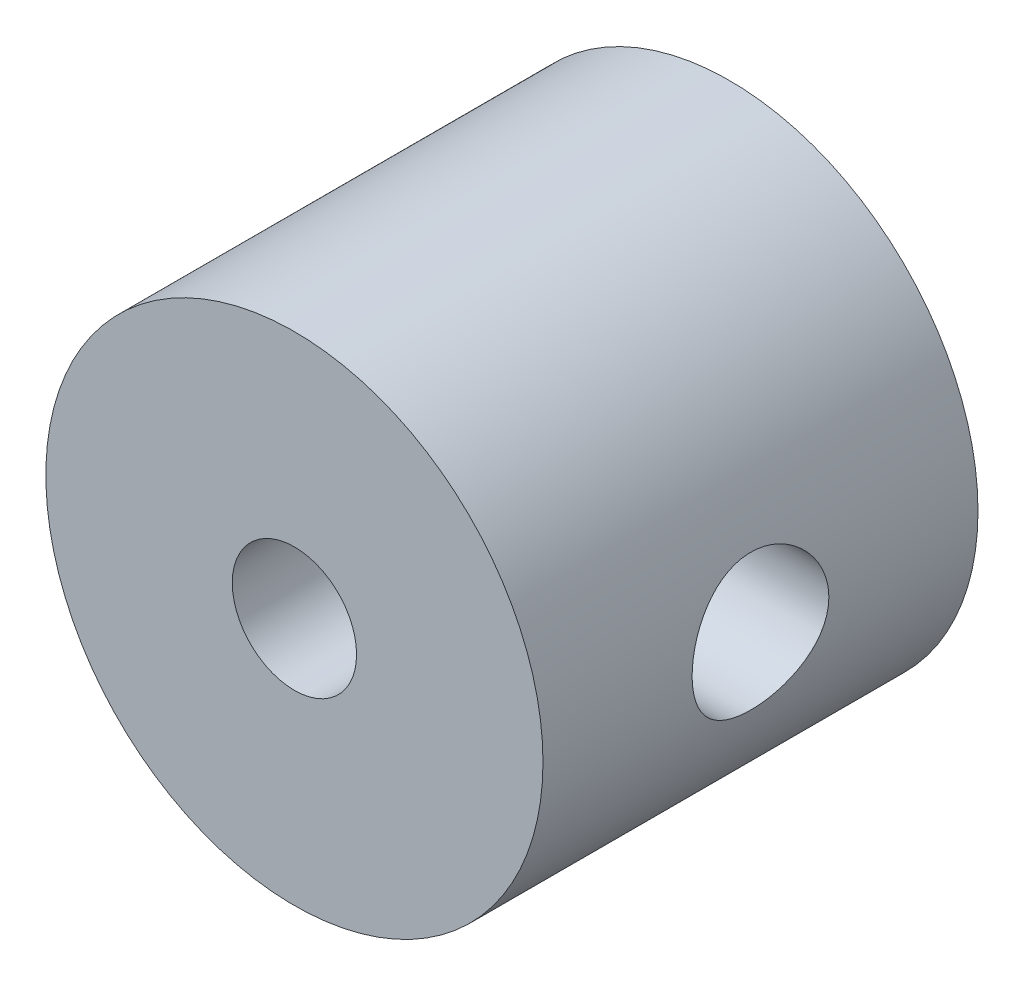
ISO-10303-21;
HEADER;
FILE_DESCRIPTION(('STEP AP214'),'2;1');
FILE_NAME('part.step','',(''),(''),'','','');
FILE_SCHEMA(('AUTOMOTIVE_DESIGN { 1 0 10303 214 1 1 1 1 }'));
ENDSEC;
DATA;
#1=APPLICATION_CONTEXT('core data for automotive mechanical design processes');
#2=APPLICATION_PROTOCOL_DEFINITION('international standard','automotive_design',2000,#1);
#3=PRODUCT_CONTEXT('',#1,'mechanical');
#4=PRODUCT('Part','Part','',(#3));
#5=PRODUCT_RELATED_PRODUCT_CATEGORY('part','',(#4));
#6=PRODUCT_DEFINITION_FORMATION('','',#4);
#7=PRODUCT_DEFINITION_CONTEXT('part definition',#1,'design');
#8=PRODUCT_DEFINITION('design','',#6,#7);
#9=PRODUCT_DEFINITION_SHAPE('','',#8);
#10=(LENGTH_UNIT() NAMED_UNIT(*) SI_UNIT(.MILLI.,.METRE.));
#11=(NAMED_UNIT(*) PLANE_ANGLE_UNIT() SI_UNIT($,.RADIAN.));
#12=(NAMED_UNIT(*) SI_UNIT($,.STERADIAN.) SOLID_ANGLE_UNIT());
#13=UNCERTAINTY_MEASURE_WITH_UNIT(LENGTH_MEASURE(1.E-05),#10,'distance_accuracy_value','');
#14=(GEOMETRIC_REPRESENTATION_CONTEXT(3) GLOBAL_UNCERTAINTY_ASSIGNED_CONTEXT((#13)) GLOBAL_UNIT_ASSIGNED_CONTEXT((#10,
#11,#12)) REPRESENTATION_CONTEXT('',''));
#15=CARTESIAN_POINT('',(0.,0.,0.));
#16=DIRECTION('',(0.,0.,1.));
#17=DIRECTION('',(1.,0.,0.));
#18=AXIS2_PLACEMENT_3D('',#15,#16,#17);
#19=CARTESIAN_POINT('',(0.,0.,7.));
#20=DIRECTION('',(0.,0.,-1.));
#21=DIRECTION('',(-1.,0.,0.));
#22=AXIS2_PLACEMENT_3D('',#19,#20,#21);
#23=CYLINDRICAL_SURFACE('',#22,1.);
#24=CARTESIAN_POINT('',(-1.,0.,4.6));
#25=CARTESIAN_POINT('',(-0.999997413382596,-0.0461935999055611,4.59999744621255));
#26=CARTESIAN_POINT('',(-0.996774009543442,-0.0924072802864802,4.59706478111157));
#27=CARTESIAN_POINT('',(-0.984135365469126,-0.183270173645057,4.58559459512755));
#28=CARTESIAN_POINT('',(-0.974714565837701,-0.227917944004272,4.57705204188608));
#29=CARTESIAN_POINT('',(-0.950439235444797,-0.314099490435056,4.55513396258018));
#30=CARTESIAN_POINT('',(-0.935619580393494,-0.355651236229688,4.54178946291795));
#31=CARTESIAN_POINT('',(-0.901371522844857,-0.435211387378228,4.51114412434922));
#32=CARTESIAN_POINT('',(-0.881941289756235,-0.473218376945291,4.493841714086));
#33=CARTESIAN_POINT('',(-0.830733817607699,-0.559750216171287,4.44864091885868));
#34=CARTESIAN_POINT('',(-0.797123705296011,-0.606419250751695,4.41926957510671));
#35=CARTESIAN_POINT('',(-0.724066843462459,-0.692033435880161,4.35668669087669));
#36=CARTESIAN_POINT('',(-0.684606039381395,-0.73095944370681,4.32346594653869));
#37=CARTESIAN_POINT('',(-0.599835972306863,-0.802080191577335,4.25444116479897));
#38=CARTESIAN_POINT('',(-0.554408972385247,-0.834090734995292,4.21859423769115));
#39=CARTESIAN_POINT('',(-0.458628995002528,-0.890366868968671,4.14751193983387));
#40=CARTESIAN_POINT('',(-0.408286439239015,-0.91464839947482,4.11227545402292));
#41=CARTESIAN_POINT('',(-0.328518608394088,-0.944913897298624,4.06347610915769));
#42=CARTESIAN_POINT('',(-0.301423796381339,-0.953934230720915,4.04797990220245));
#43=CARTESIAN_POINT('',(-0.245415517477635,-0.969855457329009,4.01927509973298));
#44=CARTESIAN_POINT('',(-0.21650294936742,-0.97675738817227,4.00606538561279));
#45=CARTESIAN_POINT('',(-0.161768486213044,-0.987151488723608,3.98543134901452));
#46=CARTESIAN_POINT('',(-0.136253946640125,-0.991023407836323,3.97740581222713));
#47=CARTESIAN_POINT('',(-0.0841293972687003,-0.996797310077885,3.96523345576019));
#48=CARTESIAN_POINT('',(-0.0575231162587482,-0.998705498615986,3.96107442194152));
#49=CARTESIAN_POINT('',(-0.00368487345721962,-1.00035768078212,3.95748228867163));
#50=CARTESIAN_POINT('',(0.0235504086489881,-1.0000840424494,3.95808769147154));
#51=CARTESIAN_POINT('',(0.0774190332654527,-0.997365628634299,3.96397239494864));
#52=CARTESIAN_POINT('',(0.104050916171061,-0.994916067397763,3.96926199803986));
#53=CARTESIAN_POINT('',(0.165134716115987,-0.986907628542622,3.98592404369788));
#54=CARTESIAN_POINT('',(0.19905872596433,-0.980560237856521,3.99877805588554));
#55=CARTESIAN_POINT('',(0.264520221117283,-0.964971724552009,4.02830781459435));
#56=CARTESIAN_POINT('',(0.296047437911223,-0.955718936624981,4.04499889344588));
#57=CARTESIAN_POINT('',(0.356011289124685,-0.93500069210764,4.07980315371074));
#58=CARTESIAN_POINT('',(0.384515627941697,-0.923618465190261,4.09785110817577));
#59=CARTESIAN_POINT('',(0.43987865650178,-0.898570894565751,4.1348799821644));
#60=CARTESIAN_POINT('',(0.46673599676826,-0.884903711948047,4.15386164437275));
#61=CARTESIAN_POINT('',(0.545150212697726,-0.840494548678882,4.21126744832668));
#62=CARTESIAN_POINT('',(0.594516205605962,-0.806356654145872,4.25013129085873));
#63=CARTESIAN_POINT('',(0.690041065382627,-0.726589684916136,4.32786992217157));
#64=CARTESIAN_POINT('',(0.735848020576531,-0.68040910400619,4.3666146928573));
#65=CARTESIAN_POINT('',(0.819130758817052,-0.577383111470024,4.43836701793394));
#66=CARTESIAN_POINT('',(0.856639453305548,-0.520581541094238,4.47139711908503));
#67=CARTESIAN_POINT('',(0.90836856048684,-0.420396816780354,4.51737607188974));
#68=CARTESIAN_POINT('',(0.926026566857098,-0.380092176276423,4.53319039377168));
#69=CARTESIAN_POINT('',(0.956180569290732,-0.296144694139348,4.56030040019855));
#70=CARTESIAN_POINT('',(0.968680455697822,-0.252504397868937,4.57159949000592));
#71=CARTESIAN_POINT('',(0.987769848900269,-0.162588690805776,4.58888605602289));
#72=CARTESIAN_POINT('',(0.994319419309795,-0.116297659482416,4.59483763879402));
#73=CARTESIAN_POINT('',(1.00083243058054,-0.0228752501559936,4.60075588104331));
#74=CARTESIAN_POINT('',(1.00079855380054,0.0242557777724427,4.60072497802465));
#75=CARTESIAN_POINT('',(0.994494161856066,0.112959318030536,4.59499652806086));
#76=CARTESIAN_POINT('',(0.988847702169953,0.154616338884016,4.58986600257866));
#77=CARTESIAN_POINT('',(0.972610508672969,0.236128702626955,4.5751555476473));
#78=CARTESIAN_POINT('',(0.962018916374754,0.275983731367878,4.56557484563787));
#79=CARTESIAN_POINT('',(0.936009376413493,0.354485072447808,4.54215173665092));
#80=CARTESIAN_POINT('',(0.920429178446549,0.393033967482868,4.52816636644858));
#81=CARTESIAN_POINT('',(0.885308854266542,0.466797504289793,4.49684964410488));
#82=CARTESIAN_POINT('',(0.865767036692628,0.502010712480986,4.47951686298106));
#83=CARTESIAN_POINT('',(0.812476537497436,0.586066715722231,4.43267339012116));
#84=CARTESIAN_POINT('',(0.776586016199378,0.632621074323963,4.4014802199056));
#85=CARTESIAN_POINT('',(0.698865293784326,0.717580214662975,4.33545862903967));
#86=CARTESIAN_POINT('',(0.657016841980906,0.755959015734746,4.30061912896785));
#87=CARTESIAN_POINT('',(0.567199529918322,0.82558973718724,4.22866308945467));
#88=CARTESIAN_POINT('',(0.519107409080054,0.856647467300842,4.19151189907109));
#89=CARTESIAN_POINT('',(0.442916612802717,0.897019794200095,4.13707899211073));
#90=CARTESIAN_POINT('',(0.416867013164181,0.90943396762841,4.11916434451911));
#91=CARTESIAN_POINT('',(0.363211415664975,0.932162525346835,4.08438140133218));
#92=CARTESIAN_POINT('',(0.335606905452031,0.942478874559684,4.06751213697605));
#93=CARTESIAN_POINT('',(0.281641683534924,0.959891933845042,4.03747164579203));
#94=CARTESIAN_POINT('',(0.25546941838693,0.967216202184917,4.02409778532448));
#95=CARTESIAN_POINT('',(0.201465121314861,0.979886987804945,4.0000062955318));
#96=CARTESIAN_POINT('',(0.173635711293967,0.985236537711594,3.98928460163036));
#97=CARTESIAN_POINT('',(0.121051192801043,0.992940144513387,3.97342975163714));
#98=CARTESIAN_POINT('',(0.0965448584047728,0.995642488921164,3.96766693065222));
#99=CARTESIAN_POINT('',(0.0468227411324124,0.999212328911158,3.95999370168162));
#100=CARTESIAN_POINT('',(0.0216086231862289,1.00008381579348,3.95807491406367));
#101=CARTESIAN_POINT('',(-0.0288334675336442,0.999903135493168,3.95846869849413));
#102=CARTESIAN_POINT('',(-0.0540613485750211,0.998846728549136,3.96079059652933));
#103=CARTESIAN_POINT('',(-0.103748131858104,0.994917595807993,3.96921145376272));
#104=CARTESIAN_POINT('',(-0.128205182574305,0.992040801767441,3.97531887230246));
#105=CARTESIAN_POINT('',(-0.18975020566956,0.98257345622637,3.99469061081341));
#106=CARTESIAN_POINT('',(-0.225972230709833,0.974797545498666,4.01005120328065));
#107=CARTESIAN_POINT('',(-0.295707658058852,0.955966594348176,4.04453395657831));
#108=CARTESIAN_POINT('',(-0.329208114501151,0.944896930383147,4.06367276155108));
#109=CARTESIAN_POINT('',(-0.391916198941776,0.920574809401493,4.10252493368209));
#110=CARTESIAN_POINT('',(-0.421261169857771,0.907499351355269,4.12212984236236));
#111=CARTESIAN_POINT('',(-0.478210399851342,0.878823938306952,4.16202322826161));
#112=CARTESIAN_POINT('',(-0.505813306159042,0.863222054174099,4.18231221838356));
#113=CARTESIAN_POINT('',(-0.586172160401017,0.81265790866932,4.2432088101628));
#114=CARTESIAN_POINT('',(-0.636569372646645,0.773901285166031,4.28390745015581));
#115=CARTESIAN_POINT('',(-0.721608886178186,0.694261343847803,4.35457159543322));
#116=CARTESIAN_POINT('',(-0.757432363412302,0.655145082614126,4.38511718150303));
#117=CARTESIAN_POINT('',(-0.823471116812241,0.569903578122291,4.44224589844985));
#118=CARTESIAN_POINT('',(-0.853696771852786,0.523791600418888,4.46883634411998));
#119=CARTESIAN_POINT('',(-0.901132549882081,0.435753368682822,4.51091548710336));
#120=CARTESIAN_POINT('',(-0.919743178486324,0.395137490234309,4.52755961317474));
#121=CARTESIAN_POINT('',(-0.951692652819549,0.310360881698918,4.55625229566961));
#122=CARTESIAN_POINT('',(-0.965038802602472,0.266205166002135,4.56830721843821));
#123=CARTESIAN_POINT('',(-0.983409166106994,0.185068519038667,4.58493415661927));
#124=CARTESIAN_POINT('',(-0.989600793486572,0.148564173739251,4.59055341668495));
#125=CARTESIAN_POINT('',(-0.997897190348776,0.0747109127929519,4.59808731119933));
#126=CARTESIAN_POINT('',(-1.00000209209204,0.0373620245179924,4.60000206553872));
#127=CARTESIAN_POINT('',(-1.,0.,4.6));
#128=B_SPLINE_CURVE_WITH_KNOTS('',3,(#24,#25,#26,#27,#28,#29,#30,#31,#32,#33,#34,#35,#36,#37,
#38,#39,#40,#41,#42,#43,#44,#45,#46,#47,#48,#49,#50,#51,#52,#53,#54,#55,#56,#57,#58,#59,#60,#61,
#62,#63,#64,#65,#66,#67,#68,#69,#70,#71,#72,#73,#74,#75,#76,#77,#78,#79,#80,#81,#82,#83,#84,#85,
#86,#87,#88,#89,#90,#91,#92,#93,#94,#95,#96,#97,#98,#99,#100,#101,#102,#103,#104,#105,#106,#107,
#108,#109,#110,#111,#112,#113,#114,#115,#116,#117,#118,#119,#120,#121,#122,#123,#124,#125,#126,
#127),.UNSPECIFIED.,.T.,.F.,(4,2,2,2,2,2,2,2,2,2,2,2,2,2,2,2,2,2,2,2,2,2,2,2,2,2,2,2,2,2,2,2,2,
2,2,2,2,2,2,2,2,2,2,2,2,2,2,2,2,2,2,4),(0.,0.138419943955773,0.276964227654643,
0.414628963533544,0.552348449767482,0.745029760517478,0.938181664262253,1.13597426258541,
1.33335625940648,1.43069821184903,1.52799240689224,1.6087871306158,1.68932575081742,
1.77051588210213,1.85188502741831,1.96175226083879,2.07206638188862,2.17873485050807,
2.28548958182163,2.49912061896591,2.72513821842561,2.95024267415707,3.0899941297033,
3.22963998877114,3.37021632168488,3.51073537831773,3.63720133930684,3.76368926326996,
3.89480020691658,4.0259672449717,4.22450096120742,4.42365647373711,4.62761477653807,
4.72942888957447,4.83114719485999,4.92186274296801,5.01243839147344,5.08809313213744,
5.16358277232208,5.23923862696643,5.31506415911223,5.43469701701541,5.55486915181229,
5.66762058352445,5.78045851961418,6.0057912751198,6.18879624533642,6.37145843428907,
6.51394157720119,6.65622633462813,6.76818592927277,6.88014190045552),.UNSPECIFIED.);
#129=CARTESIAN_POINT('',(-1.,0.,4.6));
#130=VERTEX_POINT('',#129);
#131=EDGE_CURVE('E41',#130,#130,#128,.T.);
#132=ORIENTED_EDGE('',*,*,#131,.F.);
#133=EDGE_LOOP('',(#132));
#134=FACE_BOUND('',#133,.T.);
#135=CARTESIAN_POINT('',(0.,0.,7.));
#136=DIRECTION('',(0.,0.,1.));
#137=DIRECTION('',(1.,0.,0.));
#138=AXIS2_PLACEMENT_3D('',#135,#136,#137);
#139=CIRCLE('',#138,1.);
#140=CARTESIAN_POINT('',(1.,0.,7.));
#141=VERTEX_POINT('',#140);
#142=EDGE_CURVE('E57',#141,#141,#139,.T.);
#143=ORIENTED_EDGE('',*,*,#142,.T.);
#144=EDGE_LOOP('',(#143));
#145=FACE_BOUND('',#144,.T.);
#146=ADVANCED_FACE('F36',(#134,#145),#23,.F.);
#147=CARTESIAN_POINT('',(0.,0.,7.));
#148=DIRECTION('',(0.,0.,1.));
#149=DIRECTION('',(1.,0.,0.));
#150=AXIS2_PLACEMENT_3D('',#147,#148,#149);
#151=PLANE('',#150);
#152=CARTESIAN_POINT('',(0.,0.,7.));
#153=DIRECTION('',(0.,0.,1.));
#154=DIRECTION('',(1.,0.,0.));
#155=AXIS2_PLACEMENT_3D('',#152,#153,#154);
#156=CIRCLE('',#155,4.);
#157=CARTESIAN_POINT('',(4.,0.,7.));
#158=VERTEX_POINT('',#157);
#159=EDGE_CURVE('E10',#158,#158,#156,.T.);
#160=ORIENTED_EDGE('',*,*,#159,.T.);
#161=EDGE_LOOP('',(#160));
#162=FACE_BOUND('',#161,.T.);
#163=ORIENTED_EDGE('',*,*,#142,.F.);
#164=EDGE_LOOP('',(#163));
#165=FACE_BOUND('',#164,.T.);
#166=ADVANCED_FACE('F110',(#162,#165),#151,.T.);
#167=CARTESIAN_POINT('',(0.,0.,0.));
#168=DIRECTION('',(0.,0.,1.));
#169=DIRECTION('',(1.,0.,0.));
#170=AXIS2_PLACEMENT_3D('',#167,#168,#169);
#171=PLANE('',#170);
#172=CARTESIAN_POINT('',(0.,0.,0.));
#173=DIRECTION('',(0.,0.,1.));
#174=DIRECTION('',(1.,0.,0.));
#175=AXIS2_PLACEMENT_3D('',#172,#173,#174);
#176=CIRCLE('',#175,4.);
#177=CARTESIAN_POINT('',(4.,0.,0.));
#178=VERTEX_POINT('',#177);
#179=EDGE_CURVE('E51',#178,#178,#176,.T.);
#180=ORIENTED_EDGE('',*,*,#179,.F.);
#181=EDGE_LOOP('',(#180));
#182=FACE_BOUND('',#181,.T.);
#183=CARTESIAN_POINT('',(0.,0.,0.));
#184=DIRECTION('',(0.,0.,1.));
#185=DIRECTION('',(1.,0.,0.));
#186=AXIS2_PLACEMENT_3D('',#183,#184,#185);
#187=CIRCLE('',#186,1.);
#188=CARTESIAN_POINT('',(1.,0.,0.));
#189=VERTEX_POINT('',#188);
#190=EDGE_CURVE('E60',#189,#189,#187,.T.);
#191=ORIENTED_EDGE('',*,*,#190,.T.);
#192=EDGE_LOOP('',(#191));
#193=FACE_BOUND('',#192,.T.);
#194=ADVANCED_FACE('F100',(#182,#193),#171,.F.);
#195=CARTESIAN_POINT('',(0.,0.,7.));
#196=DIRECTION('',(0.,0.,-1.));
#197=DIRECTION('',(-1.,0.,0.));
#198=AXIS2_PLACEMENT_3D('',#195,#196,#197);
#199=CYLINDRICAL_SURFACE('',#198,4.);
#200=CARTESIAN_POINT('',(-4.,0.,2.4));
#201=CARTESIAN_POINT('',(-3.99999916205506,0.0605691522184639,2.40000128600237));
#202=CARTESIAN_POINT('',(-3.99861081860311,0.121151822383712,2.40501940058165));
#203=CARTESIAN_POINT('',(-3.99320745082686,0.240567341704267,2.42492086546222));
#204=CARTESIAN_POINT('',(-3.98919127897231,0.29939941466243,2.43980852567227));
#205=CARTESIAN_POINT('',(-3.97897476904458,0.413573117000174,2.47892499097661));
#206=CARTESIAN_POINT('',(-3.97277734719594,0.468919290949671,2.50314132815133));
#207=CARTESIAN_POINT('',(-3.95885067337978,0.574765021516713,2.56018031544111));
#208=CARTESIAN_POINT('',(-3.95112129391466,0.625264174219996,2.59300368195208));
#209=CARTESIAN_POINT('',(-3.93475083046118,0.721220911873926,2.66717458668444));
#210=CARTESIAN_POINT('',(-3.92609339553496,0.76654270234146,2.70869419719738));
#211=CARTESIAN_POINT('',(-3.90894571872237,0.849675748137975,2.79871144380021));
#212=CARTESIAN_POINT('',(-3.90045549998342,0.887485970146347,2.84721003836616));
#213=CARTESIAN_POINT('',(-3.88443496615562,0.955197121920348,2.95090799812055));
#214=CARTESIAN_POINT('',(-3.87692520948763,0.984939560731474,3.00621432179875));
#215=CARTESIAN_POINT('',(-3.86395726057164,1.03464915712174,3.1212827203226));
#216=CARTESIAN_POINT('',(-3.85849866324005,1.05461824507645,3.18104391257926));
#217=CARTESIAN_POINT('',(-3.85042027313489,1.08373833335858,3.3018164425074));
#218=CARTESIAN_POINT('',(-3.84773572833664,1.09313656591461,3.36276372950258));
#219=CARTESIAN_POINT('',(-3.84531612637897,1.10161927111233,3.48542449076171));
#220=CARTESIAN_POINT('',(-3.84558047997515,1.10070580422167,3.54713780949664));
#221=CARTESIAN_POINT('',(-3.84897098790205,1.08878681242088,3.66763029914452));
#222=CARTESIAN_POINT('',(-3.85201160782452,1.07808290546841,3.72644209911347));
#223=CARTESIAN_POINT('',(-3.86047475034248,1.0473709713528,3.8414010285717));
#224=CARTESIAN_POINT('',(-3.86589747404405,1.02736215862646,3.89754793263697));
#225=CARTESIAN_POINT('',(-3.87858733790472,0.978368382690684,4.00635776433315));
#226=CARTESIAN_POINT('',(-3.88587562538702,0.949279601846995,4.05897137528814));
#227=CARTESIAN_POINT('',(-3.90146433454901,0.883023961443754,4.15867539311338));
#228=CARTESIAN_POINT('',(-3.90976496662869,0.845855421372424,4.20576464782915));
#229=CARTESIAN_POINT('',(-3.92679695778313,0.762963719090788,4.29480365866487));
#230=CARTESIAN_POINT('',(-3.93553325597258,0.716987958534714,4.33651766005862));
#231=CARTESIAN_POINT('',(-3.95219403972722,0.618586116090559,4.41169339447484));
#232=CARTESIAN_POINT('',(-3.96011848913911,0.56615974717225,4.44515476008377));
#233=CARTESIAN_POINT('',(-3.97431669414865,0.455964684948331,4.50298838776815));
#234=CARTESIAN_POINT('',(-3.98058224069301,0.398171267609413,4.52731568913169));
#235=CARTESIAN_POINT('',(-3.99069744967038,0.279102754695804,4.5658397995306));
#236=CARTESIAN_POINT('',(-3.99454767466447,0.217828473490039,4.58003896765099));
#237=CARTESIAN_POINT('',(-3.99931240446456,0.0955476708460936,4.5975282609954));
#238=CARTESIAN_POINT('',(-4.00031306992083,0.0345902441318826,4.60113865755546));
#239=CARTESIAN_POINT('',(-3.9995148615437,-0.0870599230650054,4.59823555639165));
#240=CARTESIAN_POINT('',(-3.99771629691487,-0.147752692039332,4.59172317683555));
#241=CARTESIAN_POINT('',(-3.99157757280862,-0.265991846805331,4.56902129234501));
#242=CARTESIAN_POINT('',(-3.98728489650039,-0.323575615919353,4.55301246547656));
#243=CARTESIAN_POINT('',(-3.97664687844463,-0.435233111741273,4.5119837367195));
#244=CARTESIAN_POINT('',(-3.97030130739932,-0.489306445541167,4.48696282819235));
#245=CARTESIAN_POINT('',(-3.95606198475205,-0.593636863945122,4.42803985556695));
#246=CARTESIAN_POINT('',(-3.94813916458886,-0.643793002429181,4.39396625753842));
#247=CARTESIAN_POINT('',(-3.9316600611847,-0.737787311408464,4.31811897311906));
#248=CARTESIAN_POINT('',(-3.92310364484898,-0.781624148724544,4.27634366612738));
#249=CARTESIAN_POINT('',(-3.90600127497108,-0.863100104806765,4.18478103166444));
#250=CARTESIAN_POINT('',(-3.89746340424216,-0.900512692004307,4.13479022728637));
#251=CARTESIAN_POINT('',(-3.88164592142706,-0.966425469932747,4.02905765777591));
#252=CARTESIAN_POINT('',(-3.87436625995119,-0.994926010532245,3.97331611851982));
#253=CARTESIAN_POINT('',(-3.86197407773263,-1.04199277873822,3.85792511321031));
#254=CARTESIAN_POINT('',(-3.85684940989448,-1.06061484846169,3.79829980077959));
#255=CARTESIAN_POINT('',(-3.849351184243,-1.08751746134699,3.67659764169167));
#256=CARTESIAN_POINT('',(-3.84697686828665,-1.09580085444589,3.61452147550118));
#257=CARTESIAN_POINT('',(-3.84531431661306,-1.10161954500137,3.49200674479117));
#258=CARTESIAN_POINT('',(-3.84592120142559,-1.09952009579572,3.43158669942989));
#259=CARTESIAN_POINT('',(-3.84990552246517,-1.08548586562118,3.3119977226662));
#260=CARTESIAN_POINT('',(-3.85328287860296,-1.07355136896544,3.25282875514815));
#261=CARTESIAN_POINT('',(-3.86236318670926,-1.04040366371525,3.13791401510117));
#262=CARTESIAN_POINT('',(-3.86804554959652,-1.01927248413732,3.08214283822853));
#263=CARTESIAN_POINT('',(-3.88109498569313,-0.968394733074176,2.97489426000794));
#264=CARTESIAN_POINT('',(-3.88846233813246,-0.938646733424762,2.92341757225796));
#265=CARTESIAN_POINT('',(-3.90433818327066,-0.870292452472292,2.82448721796357));
#266=CARTESIAN_POINT('',(-3.91287506866587,-0.83143915337118,2.77720876331333));
#267=CARTESIAN_POINT('',(-3.92997483169941,-0.74644089235974,2.68972419258441));
#268=CARTESIAN_POINT('',(-3.93853771522906,-0.70029413443086,2.64951982367048));
#269=CARTESIAN_POINT('',(-3.95496227841074,-0.60072816683285,2.57640493828038));
#270=CARTESIAN_POINT('',(-3.96280309518059,-0.547165139415493,2.54368516259358));
#271=CARTESIAN_POINT('',(-3.97666708919412,-0.435083915092398,2.4877654221914));
#272=CARTESIAN_POINT('',(-3.9826913587782,-0.376568723283363,2.46455973335885));
#273=CARTESIAN_POINT('',(-3.99152398311742,-0.265279772495335,2.43113091165668));
#274=CARTESIAN_POINT('',(-3.99467860698683,-0.212956611032594,2.4194849680324));
#275=CARTESIAN_POINT('',(-3.99891686895537,-0.10709239658204,2.40391937983419));
#276=CARTESIAN_POINT('',(-4.00000074085886,-0.053551481779096,2.39999886299659));
#277=CARTESIAN_POINT('',(-4.,0.,2.4));
#278=B_SPLINE_CURVE_WITH_KNOTS('',3,(#200,#201,#202,#203,#204,#205,#206,#207,#208,#209,#210,
#211,#212,#213,#214,#215,#216,#217,#218,#219,#220,#221,#222,#223,#224,#225,#226,#227,#228,#229,
#230,#231,#232,#233,#234,#235,#236,#237,#238,#239,#240,#241,#242,#243,#244,#245,#246,#247,#248,
#249,#250,#251,#252,#253,#254,#255,#256,#257,#258,#259,#260,#261,#262,#263,#264,#265,#266,#267,
#268,#269,#270,#271,#272,#273,#274,#275,#276,#277),.UNSPECIFIED.,.T.,.F.,(4,2,2,2,2,2,2,2,2,2,2,
2,2,2,2,2,2,2,2,2,2,2,2,2,2,2,2,2,2,2,2,2,2,2,2,2,2,2,4),(0.,0.181510994156708,
0.363101304182802,0.544449753327716,0.725813301590461,0.911177789828628,1.09656775989761,
1.28537207349774,1.47413908050005,1.65839290102414,1.84260990488977,2.02133609035951,
2.20007736746064,2.38094219392807,2.56184467458471,2.74903983614537,2.93624333027112,
3.12435658017962,3.31242599968217,3.49474517483048,3.67704421232687,3.85598133487827,
4.03493845068965,4.2175638519825,4.40022772543616,4.58839523012954,4.77655534682643,
4.96364016016421,5.150673390712,5.33117485695722,5.51167110541976,5.69058940903098,
5.86953738380469,6.05405824631622,6.23862461819905,6.42747058854388,6.61620277304539,
6.77670164111502,6.93718238651541),.UNSPECIFIED.);
#279=CARTESIAN_POINT('',(-4.,0.,2.4));
#280=VERTEX_POINT('',#279);
#281=EDGE_CURVE('E86',#280,#280,#278,.T.);
#282=ORIENTED_EDGE('',*,*,#281,.T.);
#283=EDGE_LOOP('',(#282));
#284=FACE_BOUND('',#283,.T.);
#285=CARTESIAN_POINT('',(4.,0.,2.4));
#286=CARTESIAN_POINT('',(3.99999916205506,-0.0605691522184639,2.40000128600237));
#287=CARTESIAN_POINT('',(3.99861081860311,-0.121151822383712,2.40501940058165));
#288=CARTESIAN_POINT('',(3.99320745082686,-0.240567341704267,2.42492086546222));
#289=CARTESIAN_POINT('',(3.98919127897231,-0.29939941466243,2.43980852567227));
#290=CARTESIAN_POINT('',(3.97897476904458,-0.413573117000174,2.47892499097661));
#291=CARTESIAN_POINT('',(3.97277734719594,-0.468919290949671,2.50314132815133));
#292=CARTESIAN_POINT('',(3.95885067337978,-0.574765021516713,2.56018031544111));
#293=CARTESIAN_POINT('',(3.95112129391466,-0.625264174219996,2.59300368195208));
#294=CARTESIAN_POINT('',(3.93475083046118,-0.721220911873926,2.66717458668444));
#295=CARTESIAN_POINT('',(3.92609339553496,-0.76654270234146,2.70869419719738));
#296=CARTESIAN_POINT('',(3.90894571872237,-0.849675748137975,2.79871144380021));
#297=CARTESIAN_POINT('',(3.90045549998342,-0.887485970146347,2.84721003836616));
#298=CARTESIAN_POINT('',(3.88443496615562,-0.955197121920348,2.95090799812055));
#299=CARTESIAN_POINT('',(3.87692520948763,-0.984939560731474,3.00621432179875));
#300=CARTESIAN_POINT('',(3.86395726057164,-1.03464915712174,3.1212827203226));
#301=CARTESIAN_POINT('',(3.85849866324005,-1.05461824507645,3.18104391257926));
#302=CARTESIAN_POINT('',(3.85042027313489,-1.08373833335858,3.3018164425074));
#303=CARTESIAN_POINT('',(3.84773572833664,-1.09313656591461,3.36276372950258));
#304=CARTESIAN_POINT('',(3.84531612637897,-1.10161927111233,3.48542449076171));
#305=CARTESIAN_POINT('',(3.84558047997515,-1.10070580422167,3.54713780949664));
#306=CARTESIAN_POINT('',(3.84897098790205,-1.08878681242088,3.66763029914452));
#307=CARTESIAN_POINT('',(3.85201160782452,-1.07808290546841,3.72644209911347));
#308=CARTESIAN_POINT('',(3.86047475034248,-1.0473709713528,3.8414010285717));
#309=CARTESIAN_POINT('',(3.86589747404405,-1.02736215862646,3.89754793263697));
#310=CARTESIAN_POINT('',(3.87858733790472,-0.978368382690684,4.00635776433315));
#311=CARTESIAN_POINT('',(3.88587562538702,-0.949279601846995,4.05897137528814));
#312=CARTESIAN_POINT('',(3.90146433454901,-0.883023961443754,4.15867539311338));
#313=CARTESIAN_POINT('',(3.90976496662869,-0.845855421372424,4.20576464782915));
#314=CARTESIAN_POINT('',(3.92679695778313,-0.762963719090788,4.29480365866487));
#315=CARTESIAN_POINT('',(3.93553325597258,-0.716987958534714,4.33651766005862));
#316=CARTESIAN_POINT('',(3.95219403972722,-0.618586116090559,4.41169339447484));
#317=CARTESIAN_POINT('',(3.96011848913911,-0.56615974717225,4.44515476008377));
#318=CARTESIAN_POINT('',(3.97431669414865,-0.455964684948331,4.50298838776815));
#319=CARTESIAN_POINT('',(3.98058224069301,-0.398171267609413,4.52731568913169));
#320=CARTESIAN_POINT('',(3.99069744967038,-0.279102754695804,4.5658397995306));
#321=CARTESIAN_POINT('',(3.99454767466447,-0.217828473490039,4.58003896765099));
#322=CARTESIAN_POINT('',(3.99931240446456,-0.0955476708460936,4.5975282609954));
#323=CARTESIAN_POINT('',(4.00031306992083,-0.0345902441318826,4.60113865755546));
#324=CARTESIAN_POINT('',(3.9995148615437,0.0870599230650054,4.59823555639165));
#325=CARTESIAN_POINT('',(3.99771629691487,0.147752692039332,4.59172317683555));
#326=CARTESIAN_POINT('',(3.99157757280862,0.265991846805331,4.56902129234501));
#327=CARTESIAN_POINT('',(3.98728489650039,0.323575615919353,4.55301246547656));
#328=CARTESIAN_POINT('',(3.97664687844463,0.435233111741273,4.5119837367195));
#329=CARTESIAN_POINT('',(3.97030130739932,0.489306445541167,4.48696282819235));
#330=CARTESIAN_POINT('',(3.95606198475205,0.593636863945122,4.42803985556695));
#331=CARTESIAN_POINT('',(3.94813916458886,0.643793002429181,4.39396625753842));
#332=CARTESIAN_POINT('',(3.9316600611847,0.737787311408464,4.31811897311906));
#333=CARTESIAN_POINT('',(3.92310364484898,0.781624148724544,4.27634366612738));
#334=CARTESIAN_POINT('',(3.90600127497108,0.863100104806765,4.18478103166444));
#335=CARTESIAN_POINT('',(3.89746340424216,0.900512692004307,4.13479022728637));
#336=CARTESIAN_POINT('',(3.88164592142706,0.966425469932747,4.02905765777591));
#337=CARTESIAN_POINT('',(3.87436625995119,0.994926010532245,3.97331611851982));
#338=CARTESIAN_POINT('',(3.86197407773263,1.04199277873822,3.85792511321031));
#339=CARTESIAN_POINT('',(3.85684940989448,1.06061484846169,3.79829980077959));
#340=CARTESIAN_POINT('',(3.849351184243,1.08751746134699,3.67659764169167));
#341=CARTESIAN_POINT('',(3.84697686828665,1.09580085444589,3.61452147550118));
#342=CARTESIAN_POINT('',(3.84531431661306,1.10161954500137,3.49200674479117));
#343=CARTESIAN_POINT('',(3.84592120142559,1.09952009579572,3.43158669942989));
#344=CARTESIAN_POINT('',(3.84990552246517,1.08548586562118,3.3119977226662));
#345=CARTESIAN_POINT('',(3.85328287860296,1.07355136896544,3.25282875514815));
#346=CARTESIAN_POINT('',(3.86236318670926,1.04040366371525,3.13791401510117));
#347=CARTESIAN_POINT('',(3.86804554959652,1.01927248413732,3.08214283822853));
#348=CARTESIAN_POINT('',(3.88109498569313,0.968394733074176,2.97489426000794));
#349=CARTESIAN_POINT('',(3.88846233813246,0.938646733424762,2.92341757225796));
#350=CARTESIAN_POINT('',(3.90433818327066,0.870292452472292,2.82448721796357));
#351=CARTESIAN_POINT('',(3.91287506866587,0.83143915337118,2.77720876331333));
#352=CARTESIAN_POINT('',(3.92997483169941,0.74644089235974,2.68972419258441));
#353=CARTESIAN_POINT('',(3.93853771522906,0.70029413443086,2.64951982367048));
#354=CARTESIAN_POINT('',(3.95496227841074,0.60072816683285,2.57640493828038));
#355=CARTESIAN_POINT('',(3.96280309518059,0.547165139415493,2.54368516259358));
#356=CARTESIAN_POINT('',(3.97666708919412,0.435083915092398,2.4877654221914));
#357=CARTESIAN_POINT('',(3.9826913587782,0.376568723283363,2.46455973335885));
#358=CARTESIAN_POINT('',(3.99152398311742,0.265279772495335,2.43113091165668));
#359=CARTESIAN_POINT('',(3.99467860698683,0.212956611032594,2.4194849680324));
#360=CARTESIAN_POINT('',(3.99891686895537,0.10709239658204,2.40391937983419));
#361=CARTESIAN_POINT('',(4.00000074085886,0.053551481779096,2.39999886299659));
#362=CARTESIAN_POINT('',(4.,0.,2.4));
#363=B_SPLINE_CURVE_WITH_KNOTS('',3,(#285,#286,#287,#288,#289,#290,#291,#292,#293,#294,#295,
#296,#297,#298,#299,#300,#301,#302,#303,#304,#305,#306,#307,#308,#309,#310,#311,#312,#313,#314,
#315,#316,#317,#318,#319,#320,#321,#322,#323,#324,#325,#326,#327,#328,#329,#330,#331,#332,#333,
#334,#335,#336,#337,#338,#339,#340,#341,#342,#343,#344,#345,#346,#347,#348,#349,#350,#351,#352,
#353,#354,#355,#356,#357,#358,#359,#360,#361,#362),.UNSPECIFIED.,.T.,.F.,(4,2,2,2,2,2,2,2,2,2,2,
2,2,2,2,2,2,2,2,2,2,2,2,2,2,2,2,2,2,2,2,2,2,2,2,2,2,2,4),(0.,0.181510994156708,
0.363101304182802,0.544449753327716,0.725813301590461,0.911177789828628,1.09656775989761,
1.28537207349774,1.47413908050005,1.65839290102414,1.84260990488977,2.02133609035951,
2.20007736746064,2.38094219392807,2.56184467458471,2.74903983614537,2.93624333027112,
3.12435658017962,3.31242599968217,3.49474517483048,3.67704421232687,3.85598133487827,
4.03493845068965,4.2175638519825,4.40022772543616,4.58839523012954,4.77655534682643,
4.96364016016421,5.150673390712,5.33117485695722,5.51167110541976,5.69058940903098,
5.86953738380469,6.05405824631622,6.23862461819905,6.42747058854388,6.61620277304539,
6.77670164111502,6.93718238651541),.UNSPECIFIED.);
#364=CARTESIAN_POINT('',(4.,0.,2.4));
#365=VERTEX_POINT('',#364);
#366=EDGE_CURVE('E80',#365,#365,#363,.T.);
#367=ORIENTED_EDGE('',*,*,#366,.T.);
#368=EDGE_LOOP('',(#367));
#369=FACE_BOUND('',#368,.T.);
#370=ORIENTED_EDGE('',*,*,#159,.F.);
#371=EDGE_LOOP('',(#370));
#372=FACE_BOUND('',#371,.T.);
#373=ORIENTED_EDGE('',*,*,#179,.T.);
#374=EDGE_LOOP('',(#373));
#375=FACE_BOUND('',#374,.T.);
#376=ADVANCED_FACE('F38',(#284,#369,#372,#375),#199,.T.);
#377=CARTESIAN_POINT('',(-1.,0.,2.4));
#378=CARTESIAN_POINT('',(-0.999997413382596,0.0461935999055611,2.40000255378745));
#379=CARTESIAN_POINT('',(-0.996774009543442,0.0924072802864801,2.40293521888843));
#380=CARTESIAN_POINT('',(-0.984135365469126,0.183270173645057,2.41440540487245));
#381=CARTESIAN_POINT('',(-0.974714565837701,0.227917944004272,2.42294795811392));
#382=CARTESIAN_POINT('',(-0.950439235444797,0.314099490435056,2.44486603741982));
#383=CARTESIAN_POINT('',(-0.935619580393494,0.355651236229688,2.45821053708205));
#384=CARTESIAN_POINT('',(-0.901371522844857,0.435211387378228,2.48885587565078));
#385=CARTESIAN_POINT('',(-0.881941289756235,0.473218376945291,2.506158285914));
#386=CARTESIAN_POINT('',(-0.830733817607699,0.559750216171288,2.55135908114132));
#387=CARTESIAN_POINT('',(-0.797123705296011,0.606419250751695,2.58073042489329));
#388=CARTESIAN_POINT('',(-0.724066843462458,0.692033435880161,2.64331330912331));
#389=CARTESIAN_POINT('',(-0.684606039381395,0.73095944370681,2.67653405346131));
#390=CARTESIAN_POINT('',(-0.599835972306863,0.802080191577335,2.74555883520103));
#391=CARTESIAN_POINT('',(-0.554408972385246,0.834090734995292,2.78140576230885));
#392=CARTESIAN_POINT('',(-0.458628995002528,0.890366868968671,2.85248806016613));
#393=CARTESIAN_POINT('',(-0.408286439239015,0.914648399474821,2.88772454597709));
#394=CARTESIAN_POINT('',(-0.328518608394087,0.944913897298624,2.93652389084231));
#395=CARTESIAN_POINT('',(-0.301423796381338,0.953934230720915,2.95202009779755));
#396=CARTESIAN_POINT('',(-0.245415517477635,0.969855457329009,2.98072490026702));
#397=CARTESIAN_POINT('',(-0.216502949367419,0.97675738817227,2.99393461438721));
#398=CARTESIAN_POINT('',(-0.161768486213043,0.987151488723608,3.01456865098548));
#399=CARTESIAN_POINT('',(-0.136253946640125,0.991023407836323,3.02259418777287));
#400=CARTESIAN_POINT('',(-0.0841293972687,0.996797310077885,3.03476654423981));
#401=CARTESIAN_POINT('',(-0.0575231162587479,0.998705498615986,3.03892557805848));
#402=CARTESIAN_POINT('',(-0.00368487345721945,1.00035768078212,3.04251771132837));
#403=CARTESIAN_POINT('',(0.0235504086489882,1.0000840424494,3.04191230852846));
#404=CARTESIAN_POINT('',(0.0774190332654528,0.997365628634299,3.03602760505136));
#405=CARTESIAN_POINT('',(0.104050916171061,0.994916067397763,3.03073800196014));
#406=CARTESIAN_POINT('',(0.165134716115987,0.986907628542622,3.01407595630212));
#407=CARTESIAN_POINT('',(0.19905872596433,0.980560237856522,3.00122194411446));
#408=CARTESIAN_POINT('',(0.264520221117283,0.964971724552009,2.97169218540565));
#409=CARTESIAN_POINT('',(0.296047437911223,0.955718936624981,2.95500110655412));
#410=CARTESIAN_POINT('',(0.356011289124685,0.93500069210764,2.92019684628926));
#411=CARTESIAN_POINT('',(0.384515627941697,0.923618465190261,2.90214889182423));
#412=CARTESIAN_POINT('',(0.43987865650178,0.898570894565751,2.8651200178356));
#413=CARTESIAN_POINT('',(0.46673599676826,0.884903711948047,2.84613835562725));
#414=CARTESIAN_POINT('',(0.545150212697726,0.840494548678882,2.78873255167332));
#415=CARTESIAN_POINT('',(0.594516205605962,0.806356654145872,2.74986870914127));
#416=CARTESIAN_POINT('',(0.690041065382626,0.726589684916136,2.67213007782843));
#417=CARTESIAN_POINT('',(0.735848020576531,0.680409104006191,2.6333853071427));
#418=CARTESIAN_POINT('',(0.819130758817051,0.577383111470024,2.56163298206606));
#419=CARTESIAN_POINT('',(0.856639453305548,0.520581541094238,2.52860288091497));
#420=CARTESIAN_POINT('',(0.90836856048684,0.420396816780354,2.48262392811026));
#421=CARTESIAN_POINT('',(0.926026566857098,0.380092176276423,2.46680960622832));
#422=CARTESIAN_POINT('',(0.956180569290732,0.296144694139348,2.43969959980145));
#423=CARTESIAN_POINT('',(0.968680455697822,0.252504397868937,2.42840050999408));
#424=CARTESIAN_POINT('',(0.98776984890027,0.162588690805776,2.41111394397711));
#425=CARTESIAN_POINT('',(0.994319419309795,0.116297659482416,2.40516236120598));
#426=CARTESIAN_POINT('',(1.00083243058054,0.0228752501559934,2.39924411895669));
#427=CARTESIAN_POINT('',(1.00079855380054,-0.0242557777724431,2.39927502197535));
#428=CARTESIAN_POINT('',(0.994494161856066,-0.112959318030536,2.40500347193914));
#429=CARTESIAN_POINT('',(0.988847702169953,-0.154616338884017,2.41013399742134));
#430=CARTESIAN_POINT('',(0.972610508672969,-0.236128702626955,2.42484445235271));
#431=CARTESIAN_POINT('',(0.962018916374754,-0.275983731367878,2.43442515436213));
#432=CARTESIAN_POINT('',(0.936009376413493,-0.354485072447808,2.45784826334908));
#433=CARTESIAN_POINT('',(0.920429178446549,-0.393033967482868,2.47183363355141));
#434=CARTESIAN_POINT('',(0.885308854266542,-0.466797504289793,2.50315035589512));
#435=CARTESIAN_POINT('',(0.865767036692628,-0.502010712480986,2.52048313701894));
#436=CARTESIAN_POINT('',(0.812476537497436,-0.586066715722232,2.56732660987884));
#437=CARTESIAN_POINT('',(0.776586016199378,-0.632621074323964,2.5985197800944));
#438=CARTESIAN_POINT('',(0.698865293784326,-0.717580214662975,2.66454137096033));
#439=CARTESIAN_POINT('',(0.657016841980905,-0.755959015734746,2.69938087103215));
#440=CARTESIAN_POINT('',(0.567199529918322,-0.82558973718724,2.77133691054532));
#441=CARTESIAN_POINT('',(0.519107409080053,-0.856647467300842,2.80848810092891));
#442=CARTESIAN_POINT('',(0.442916612802717,-0.897019794200096,2.86292100788927));
#443=CARTESIAN_POINT('',(0.41686701316418,-0.90943396762841,2.88083565548089));
#444=CARTESIAN_POINT('',(0.363211415664974,-0.932162525346835,2.91561859866782));
#445=CARTESIAN_POINT('',(0.33560690545203,-0.942478874559684,2.93248786302395));
#446=CARTESIAN_POINT('',(0.281641683534923,-0.959891933845042,2.96252835420798));
#447=CARTESIAN_POINT('',(0.255469418386929,-0.967216202184917,2.97590221467552));
#448=CARTESIAN_POINT('',(0.201465121314861,-0.979886987804945,2.9999937044682));
#449=CARTESIAN_POINT('',(0.173635711293966,-0.985236537711594,3.01071539836964));
#450=CARTESIAN_POINT('',(0.121051192801042,-0.992940144513387,3.02657024836286));
#451=CARTESIAN_POINT('',(0.0965448584047723,-0.995642488921165,3.03233306934778));
#452=CARTESIAN_POINT('',(0.046822741132412,-0.999212328911158,3.04000629831838));
#453=CARTESIAN_POINT('',(0.0216086231862283,-1.00008381579348,3.04192508593633));
#454=CARTESIAN_POINT('',(-0.0288334675336448,-0.999903135493168,3.04153130150587));
#455=CARTESIAN_POINT('',(-0.0540613485750216,-0.998846728549136,3.03920940347067));
#456=CARTESIAN_POINT('',(-0.103748131858104,-0.994917595807993,3.03078854623728));
#457=CARTESIAN_POINT('',(-0.128205182574305,-0.992040801767441,3.02468112769754));
#458=CARTESIAN_POINT('',(-0.18975020566956,-0.98257345622637,3.00530938918659));
#459=CARTESIAN_POINT('',(-0.225972230709834,-0.974797545498666,2.98994879671935));
#460=CARTESIAN_POINT('',(-0.295707658058853,-0.955966594348176,2.95546604342169));
#461=CARTESIAN_POINT('',(-0.329208114501152,-0.944896930383146,2.93632723844892));
#462=CARTESIAN_POINT('',(-0.391916198941777,-0.920574809401493,2.89747506631792));
#463=CARTESIAN_POINT('',(-0.421261169857771,-0.907499351355269,2.87787015763764));
#464=CARTESIAN_POINT('',(-0.478210399851342,-0.878823938306952,2.83797677173839));
#465=CARTESIAN_POINT('',(-0.505813306159042,-0.863222054174099,2.81768778161644));
#466=CARTESIAN_POINT('',(-0.586172160401018,-0.81265790866932,2.7567911898372));
#467=CARTESIAN_POINT('',(-0.636569372646646,-0.773901285166031,2.71609254984418));
#468=CARTESIAN_POINT('',(-0.721608886178186,-0.694261343847802,2.64542840456678));
#469=CARTESIAN_POINT('',(-0.757432363412302,-0.655145082614125,2.61488281849697));
#470=CARTESIAN_POINT('',(-0.823471116812242,-0.56990357812229,2.55775410155015));
#471=CARTESIAN_POINT('',(-0.853696771852787,-0.523791600418887,2.53116365588002));
#472=CARTESIAN_POINT('',(-0.901132549882082,-0.435753368682821,2.48908451289664));
#473=CARTESIAN_POINT('',(-0.919743178486325,-0.395137490234308,2.47244038682526));
#474=CARTESIAN_POINT('',(-0.951692652819549,-0.310360881698917,2.44374770433039));
#475=CARTESIAN_POINT('',(-0.965038802602472,-0.266205166002134,2.43169278156179));
#476=CARTESIAN_POINT('',(-0.983409166106994,-0.185068519038667,2.41506584338073));
#477=CARTESIAN_POINT('',(-0.989600793486572,-0.14856417373925,2.40944658331505));
#478=CARTESIAN_POINT('',(-0.997897190348776,-0.0747109127929518,2.40191268880067));
#479=CARTESIAN_POINT('',(-1.00000209209204,-0.0373620245179924,2.39999793446128));
#480=CARTESIAN_POINT('',(-1.,0.,2.4));
#481=B_SPLINE_CURVE_WITH_KNOTS('',3,(#377,#378,#379,#380,#381,#382,#383,#384,#385,#386,#387,
#388,#389,#390,#391,#392,#393,#394,#395,#396,#397,#398,#399,#400,#401,#402,#403,#404,#405,#406,
#407,#408,#409,#410,#411,#412,#413,#414,#415,#416,#417,#418,#419,#420,#421,#422,#423,#424,#425,
#426,#427,#428,#429,#430,#431,#432,#433,#434,#435,#436,#437,#438,#439,#440,#441,#442,#443,#444,
#445,#446,#447,#448,#449,#450,#451,#452,#453,#454,#455,#456,#457,#458,#459,#460,#461,#462,#463,
#464,#465,#466,#467,#468,#469,#470,#471,#472,#473,#474,#475,#476,#477,#478,#479,#480),
.UNSPECIFIED.,.T.,.F.,(4,2,2,2,2,2,2,2,2,2,2,2,2,2,2,2,2,2,2,2,2,2,2,2,2,2,2,2,2,2,2,2,2,2,2,2,
2,2,2,2,2,2,2,2,2,2,2,2,2,2,2,4),(0.,0.138419943955773,0.276964227654643,0.414628963533544,
0.552348449767482,0.745029760517478,0.938181664262254,1.13597426258541,1.33335625940648,
1.43069821184903,1.52799240689224,1.6087871306158,1.68932575081742,1.77051588210213,
1.85188502741831,1.96175226083879,2.07206638188862,2.17873485050807,2.28548958182163,
2.49912061896591,2.72513821842561,2.95024267415707,3.0899941297033,3.22963998877114,
3.37021632168488,3.51073537831773,3.63720133930684,3.76368926326996,3.89480020691658,
4.0259672449717,4.22450096120742,4.42365647373711,4.62761477653807,4.72942888957447,
4.83114719486,4.92186274296801,5.01243839147344,5.08809313213744,5.16358277232208,
5.23923862696644,5.31506415911223,5.43469701701541,5.55486915181229,5.66762058352445,
5.78045851961418,6.0057912751198,6.18879624533642,6.37145843428907,6.51394157720119,
6.65622633462813,6.76818592927277,6.88014190045552),.UNSPECIFIED.);
#482=CARTESIAN_POINT('',(-1.,0.,2.4));
#483=VERTEX_POINT('',#482);
#484=EDGE_CURVE('E62',#483,#483,#481,.T.);
#485=ORIENTED_EDGE('',*,*,#484,.F.);
#486=EDGE_LOOP('',(#485));
#487=FACE_BOUND('',#486,.T.);
#488=ORIENTED_EDGE('',*,*,#190,.F.);
#489=EDGE_LOOP('',(#488));
#490=FACE_BOUND('',#489,.T.);
#491=ADVANCED_FACE('F68',(#487,#490),#23,.F.);
#492=CARTESIAN_POINT('',(-4.,0.,3.5));
#493=DIRECTION('',(1.,0.,0.));
#494=DIRECTION('',(0.,0.,-1.));
#495=AXIS2_PLACEMENT_3D('',#492,#493,#494);
#496=CYLINDRICAL_SURFACE('',#495,1.1);
#497=ORIENTED_EDGE('',*,*,#131,.T.);
#498=EDGE_LOOP('',(#497));
#499=FACE_BOUND('',#498,.T.);
#500=ORIENTED_EDGE('',*,*,#484,.T.);
#501=EDGE_LOOP('',(#500));
#502=FACE_BOUND('',#501,.T.);
#503=ORIENTED_EDGE('',*,*,#366,.F.);
#504=EDGE_LOOP('',(#503));
#505=FACE_BOUND('',#504,.T.);
#506=ORIENTED_EDGE('',*,*,#281,.F.);
#507=EDGE_LOOP('',(#506));
#508=FACE_BOUND('',#507,.T.);
#509=ADVANCED_FACE('F71',(#499,#502,#505,#508),#496,.F.);
#510=CLOSED_SHELL('',(#146,#166,#194,#376,#491,#509));
#511=MANIFOLD_SOLID_BREP('B2',#510);
#512=ADVANCED_BREP_SHAPE_REPRESENTATION('',(#18,#511),#14);
#513=SHAPE_DEFINITION_REPRESENTATION(#9,#512);
ENDSEC;
END-ISO-10303-21;
